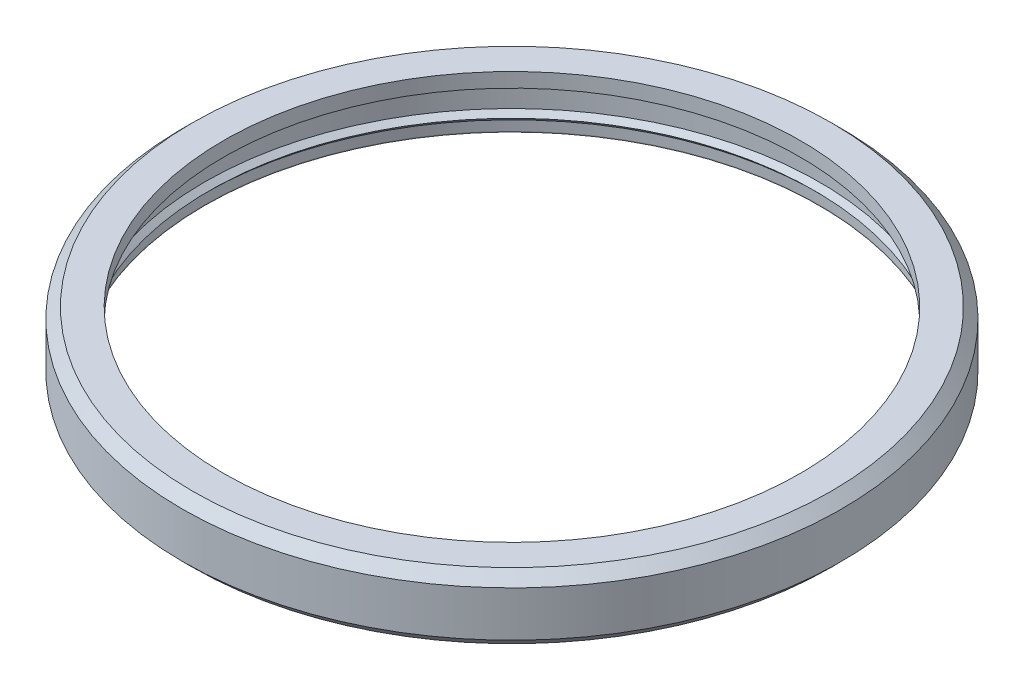
ISO-10303-21;
HEADER;
FILE_DESCRIPTION(('STEP AP214'),'2;1');
FILE_NAME('part.step','',(''),(''),'','','');
FILE_SCHEMA(('AUTOMOTIVE_DESIGN { 1 0 10303 214 1 1 1 1 }'));
ENDSEC;
DATA;
#1=APPLICATION_CONTEXT('core data for automotive mechanical design processes');
#2=APPLICATION_PROTOCOL_DEFINITION('international standard','automotive_design',2000,#1);
#3=PRODUCT_CONTEXT('',#1,'mechanical');
#4=PRODUCT('Part','Part','',(#3));
#5=PRODUCT_RELATED_PRODUCT_CATEGORY('part','',(#4));
#6=PRODUCT_DEFINITION_FORMATION('','',#4);
#7=PRODUCT_DEFINITION_CONTEXT('part definition',#1,'design');
#8=PRODUCT_DEFINITION('design','',#6,#7);
#9=PRODUCT_DEFINITION_SHAPE('','',#8);
#10=(LENGTH_UNIT() NAMED_UNIT(*) SI_UNIT(.MILLI.,.METRE.));
#11=(NAMED_UNIT(*) PLANE_ANGLE_UNIT() SI_UNIT($,.RADIAN.));
#12=(NAMED_UNIT(*) SI_UNIT($,.STERADIAN.) SOLID_ANGLE_UNIT());
#13=UNCERTAINTY_MEASURE_WITH_UNIT(LENGTH_MEASURE(1.E-05),#10,'distance_accuracy_value','');
#14=(GEOMETRIC_REPRESENTATION_CONTEXT(3) GLOBAL_UNCERTAINTY_ASSIGNED_CONTEXT((#13)) GLOBAL_UNIT_ASSIGNED_CONTEXT((#10,
#11,#12)) REPRESENTATION_CONTEXT('',''));
#15=CARTESIAN_POINT('',(0.,0.,0.));
#16=DIRECTION('',(0.,0.,1.));
#17=DIRECTION('',(1.,0.,0.));
#18=AXIS2_PLACEMENT_3D('',#15,#16,#17);
#19=CARTESIAN_POINT('',(0.,2.4,0.));
#20=DIRECTION('',(0.,-1.,0.));
#21=DIRECTION('',(0.,0.,-1.));
#22=AXIS2_PLACEMENT_3D('',#19,#20,#21);
#23=CYLINDRICAL_SURFACE('',#22,32.);
#24=CARTESIAN_POINT('',(0.,0.399999999999975,0.));
#25=DIRECTION('',(0.,1.,0.));
#26=DIRECTION('',(0.,0.,1.));
#27=AXIS2_PLACEMENT_3D('',#24,#25,#26);
#28=CIRCLE('',#27,32.);
#29=CARTESIAN_POINT('',(0.,0.399999999999975,32.));
#30=VERTEX_POINT('',#29);
#31=EDGE_CURVE('E10',#30,#30,#28,.F.);
#32=ORIENTED_EDGE('',*,*,#31,.T.);
#33=EDGE_LOOP('',(#32));
#34=FACE_BOUND('',#33,.T.);
#35=CARTESIAN_POINT('',(0.,-3.99999999999996,0.));
#36=DIRECTION('',(0.,1.,0.));
#37=DIRECTION('',(0.,0.,1.));
#38=AXIS2_PLACEMENT_3D('',#35,#36,#37);
#39=CIRCLE('',#38,32.);
#40=CARTESIAN_POINT('',(0.,-3.99999999999996,32.));
#41=VERTEX_POINT('',#40);
#42=EDGE_CURVE('E58',#41,#41,#39,.T.);
#43=ORIENTED_EDGE('',*,*,#42,.T.);
#44=EDGE_LOOP('',(#43));
#45=FACE_BOUND('',#44,.T.);
#46=ADVANCED_FACE('F43',(#34,#45),#23,.T.);
#47=CARTESIAN_POINT('',(0.,-7.6,0.));
#48=DIRECTION('',(0.,1.,0.));
#49=DIRECTION('',(0.,0.,1.));
#50=AXIS2_PLACEMENT_3D('',#47,#48,#49);
#51=CYLINDRICAL_SURFACE('',#50,28.);
#52=CARTESIAN_POINT('',(0.,0.,0.));
#53=DIRECTION('',(0.,1.,0.));
#54=DIRECTION('',(0.,0.,1.));
#55=AXIS2_PLACEMENT_3D('',#52,#53,#54);
#56=CIRCLE('',#55,28.);
#57=CARTESIAN_POINT('',(0.,0.,28.));
#58=VERTEX_POINT('',#57);
#59=EDGE_CURVE('E75',#58,#58,#56,.T.);
#60=ORIENTED_EDGE('',*,*,#59,.F.);
#61=EDGE_LOOP('',(#60));
#62=FACE_BOUND('',#61,.T.);
#63=CARTESIAN_POINT('',(0.,1.4,0.));
#64=DIRECTION('',(0.,1.,0.));
#65=DIRECTION('',(0.,0.,1.));
#66=AXIS2_PLACEMENT_3D('',#63,#64,#65);
#67=CIRCLE('',#66,28.);
#68=CARTESIAN_POINT('',(0.,1.4,28.));
#69=VERTEX_POINT('',#68);
#70=EDGE_CURVE('E71',#69,#69,#67,.F.);
#71=ORIENTED_EDGE('',*,*,#70,.F.);
#72=EDGE_LOOP('',(#71));
#73=FACE_BOUND('',#72,.T.);
#74=ADVANCED_FACE('F124',(#62,#73),#51,.F.);
#75=CARTESIAN_POINT('',(0.,-0.999999999999997,0.));
#76=DIRECTION('',(0.,-1.,0.));
#77=DIRECTION('',(1.,0.,0.));
#78=AXIS2_PLACEMENT_3D('',#75,#76,#77);
#79=TOROIDAL_SURFACE('',#78,28.8488095238095,1.00119047619048);
#80=CARTESIAN_POINT('',(0.,0.,0.));
#81=DIRECTION('',(0.,1.,0.));
#82=DIRECTION('',(0.,0.,1.));
#83=AXIS2_PLACEMENT_3D('',#80,#81,#82);
#84=CIRCLE('',#83,28.8976190476191);
#85=CARTESIAN_POINT('',(0.,0.,28.8976190476191));
#86=VERTEX_POINT('',#85);
#87=EDGE_CURVE('E70',#86,#86,#84,.T.);
#88=ORIENTED_EDGE('',*,*,#87,.T.);
#89=EDGE_LOOP('',(#88));
#90=FACE_BOUND('',#89,.T.);
#91=CARTESIAN_POINT('',(0.,-0.999999999999997,0.));
#92=DIRECTION('',(0.,-1.,0.));
#93=DIRECTION('',(1.,0.,0.));
#94=AXIS2_PLACEMENT_3D('',#91,#92,#93);
#95=CIRCLE('',#94,29.85);
#96=CARTESIAN_POINT('',(29.85,-1.,0.));
#97=VERTEX_POINT('',#96);
#98=EDGE_CURVE('E82',#97,#97,#95,.T.);
#99=ORIENTED_EDGE('',*,*,#98,.T.);
#100=EDGE_LOOP('',(#99));
#101=FACE_BOUND('',#100,.T.);
#102=ADVANCED_FACE('F129',(#90,#101),#79,.F.);
#103=CARTESIAN_POINT('',(0.,-25.,0.));
#104=DIRECTION('',(0.,-1.,0.));
#105=DIRECTION('',(1.,0.,0.));
#106=AXIS2_PLACEMENT_3D('',#103,#104,#105);
#107=CYLINDRICAL_SURFACE('',#106,29.85);
#108=ORIENTED_EDGE('',*,*,#98,.F.);
#109=EDGE_LOOP('',(#108));
#110=FACE_BOUND('',#109,.T.);
#111=CARTESIAN_POINT('',(0.,-3.02071067811865,0.));
#112=DIRECTION('',(0.,-1.,0.));
#113=DIRECTION('',(1.,0.,0.));
#114=AXIS2_PLACEMENT_3D('',#111,#112,#113);
#115=CIRCLE('',#114,29.85);
#116=CARTESIAN_POINT('',(29.85,-3.02071067811865,0.));
#117=VERTEX_POINT('',#116);
#118=EDGE_CURVE('E86',#117,#117,#115,.T.);
#119=ORIENTED_EDGE('',*,*,#118,.T.);
#120=EDGE_LOOP('',(#119));
#121=FACE_BOUND('',#120,.T.);
#122=ADVANCED_FACE('F191',(#110,#121),#107,.F.);
#123=CARTESIAN_POINT('',(0.,-3.5,0.));
#124=DIRECTION('',(0.,1.,0.));
#125=DIRECTION('',(-1.,0.,0.));
#126=AXIS2_PLACEMENT_3D('',#123,#124,#125);
#127=CONICAL_SURFACE('',#126,29.3707106781186,0.785398163397448);
#128=ORIENTED_EDGE('',*,*,#118,.F.);
#129=EDGE_LOOP('',(#128));
#130=FACE_BOUND('',#129,.T.);
#131=CARTESIAN_POINT('',(0.,-3.5,0.));
#132=DIRECTION('',(0.,-1.,0.));
#133=DIRECTION('',(1.,0.,0.));
#134=AXIS2_PLACEMENT_3D('',#131,#132,#133);
#135=CIRCLE('',#134,29.3707106781186);
#136=CARTESIAN_POINT('',(29.3707106781186,-3.50000000000001,0.));
#137=VERTEX_POINT('',#136);
#138=EDGE_CURVE('E89',#137,#137,#135,.T.);
#139=ORIENTED_EDGE('',*,*,#138,.T.);
#140=EDGE_LOOP('',(#139));
#141=FACE_BOUND('',#140,.T.);
#142=ADVANCED_FACE('F182',(#130,#141),#127,.F.);
#143=CARTESIAN_POINT('',(0.,-3.95750896858179,0.));
#144=DIRECTION('',(0.,-1.,0.));
#145=DIRECTION('',(1.,0.,0.));
#146=AXIS2_PLACEMENT_3D('',#143,#144,#145);
#147=CONICAL_SURFACE('',#146,29.8282196467004,0.78539816339746);
#148=ORIENTED_EDGE('',*,*,#138,.F.);
#149=EDGE_LOOP('',(#148));
#150=FACE_BOUND('',#149,.T.);
#151=CARTESIAN_POINT('',(0.,-3.95750896858179,0.));
#152=DIRECTION('',(0.,-1.,0.));
#153=DIRECTION('',(1.,0.,0.));
#154=AXIS2_PLACEMENT_3D('',#151,#152,#153);
#155=CIRCLE('',#154,29.8282196467004);
#156=CARTESIAN_POINT('',(29.8282196467004,-3.95750896858179,0.));
#157=VERTEX_POINT('',#156);
#158=EDGE_CURVE('E93',#157,#157,#155,.T.);
#159=ORIENTED_EDGE('',*,*,#158,.T.);
#160=EDGE_LOOP('',(#159));
#161=FACE_BOUND('',#160,.T.);
#162=ADVANCED_FACE('F173',(#150,#161),#147,.F.);
#163=CARTESIAN_POINT('',(0.,-4.95,0.));
#164=DIRECTION('',(0.,-1.,0.));
#165=DIRECTION('',(1.,0.,0.));
#166=AXIS2_PLACEMENT_3D('',#163,#164,#165);
#167=CONICAL_SURFACE('',#166,29.85,0.0219416168272341);
#168=ORIENTED_EDGE('',*,*,#158,.F.);
#169=EDGE_LOOP('',(#168));
#170=FACE_BOUND('',#169,.T.);
#171=CARTESIAN_POINT('',(0.,-4.95,0.));
#172=DIRECTION('',(0.,-1.,0.));
#173=DIRECTION('',(1.,0.,0.));
#174=AXIS2_PLACEMENT_3D('',#171,#172,#173);
#175=CIRCLE('',#174,29.85);
#176=CARTESIAN_POINT('',(29.85,-4.95,0.));
#177=VERTEX_POINT('',#176);
#178=EDGE_CURVE('E97',#177,#177,#175,.T.);
#179=ORIENTED_EDGE('',*,*,#178,.T.);
#180=EDGE_LOOP('',(#179));
#181=FACE_BOUND('',#180,.T.);
#182=ADVANCED_FACE('F120',(#170,#181),#167,.F.);
#183=CARTESIAN_POINT('',(0.,-25.,0.));
#184=DIRECTION('',(0.,-1.,0.));
#185=DIRECTION('',(1.,0.,0.));
#186=AXIS2_PLACEMENT_3D('',#183,#184,#185);
#187=CYLINDRICAL_SURFACE('',#186,29.85);
#188=CARTESIAN_POINT('',(0.,-5.,0.));
#189=DIRECTION('',(0.,-1.,0.));
#190=DIRECTION('',(1.,0.,0.));
#191=AXIS2_PLACEMENT_3D('',#188,#189,#190);
#192=CIRCLE('',#191,29.85);
#193=CARTESIAN_POINT('',(29.85,-5.,0.));
#194=VERTEX_POINT('',#193);
#195=EDGE_CURVE('E79',#194,#194,#192,.T.);
#196=ORIENTED_EDGE('',*,*,#195,.T.);
#197=EDGE_LOOP('',(#196));
#198=FACE_BOUND('',#197,.T.);
#199=ORIENTED_EDGE('',*,*,#178,.F.);
#200=EDGE_LOOP('',(#199));
#201=FACE_BOUND('',#200,.T.);
#202=ADVANCED_FACE('F105',(#198,#201),#187,.F.);
#203=CARTESIAN_POINT('',(0.,-5.,0.));
#204=DIRECTION('',(0.,1.,0.));
#205=DIRECTION('',(-1.,0.,0.));
#206=AXIS2_PLACEMENT_3D('',#203,#204,#205);
#207=PLANE('',#206);
#208=CARTESIAN_POINT('',(0.,-5.,0.));
#209=DIRECTION('',(0.,1.,0.));
#210=DIRECTION('',(-1.,0.,0.));
#211=AXIS2_PLACEMENT_3D('',#208,#209,#210);
#212=CIRCLE('',#211,31.);
#213=CARTESIAN_POINT('',(-31.,-5.,0.));
#214=VERTEX_POINT('',#213);
#215=EDGE_CURVE('E64',#214,#214,#212,.F.);
#216=ORIENTED_EDGE('',*,*,#215,.T.);
#217=EDGE_LOOP('',(#216));
#218=FACE_BOUND('',#217,.T.);
#219=ORIENTED_EDGE('',*,*,#195,.F.);
#220=EDGE_LOOP('',(#219));
#221=FACE_BOUND('',#220,.T.);
#222=ADVANCED_FACE('F108',(#218,#221),#207,.F.);
#223=CARTESIAN_POINT('',(0.,0.,0.));
#224=DIRECTION('',(0.,1.,0.));
#225=DIRECTION('',(0.,0.,1.));
#226=AXIS2_PLACEMENT_3D('',#223,#224,#225);
#227=PLANE('',#226);
#228=ORIENTED_EDGE('',*,*,#59,.T.);
#229=EDGE_LOOP('',(#228));
#230=FACE_BOUND('',#229,.T.);
#231=ORIENTED_EDGE('',*,*,#87,.F.);
#232=EDGE_LOOP('',(#231));
#233=FACE_BOUND('',#232,.T.);
#234=ADVANCED_FACE('F110',(#230,#233),#227,.F.);
#235=CARTESIAN_POINT('',(0.,1.4,0.));
#236=DIRECTION('',(0.,1.,0.));
#237=DIRECTION('',(0.,0.,1.));
#238=AXIS2_PLACEMENT_3D('',#235,#236,#237);
#239=PLANE('',#238);
#240=CARTESIAN_POINT('',(0.,1.4,0.));
#241=DIRECTION('',(0.,1.,0.));
#242=DIRECTION('',(0.,0.,1.));
#243=AXIS2_PLACEMENT_3D('',#240,#241,#242);
#244=CIRCLE('',#243,31.);
#245=CARTESIAN_POINT('',(0.,1.4,31.));
#246=VERTEX_POINT('',#245);
#247=EDGE_CURVE('E52',#246,#246,#244,.T.);
#248=ORIENTED_EDGE('',*,*,#247,.T.);
#249=EDGE_LOOP('',(#248));
#250=FACE_BOUND('',#249,.T.);
#251=ORIENTED_EDGE('',*,*,#70,.T.);
#252=EDGE_LOOP('',(#251));
#253=FACE_BOUND('',#252,.T.);
#254=ADVANCED_FACE('F117',(#250,#253),#239,.T.);
#255=CARTESIAN_POINT('',(0.,-5.,0.));
#256=DIRECTION('',(0.,1.,0.));
#257=DIRECTION('',(0.,0.,1.));
#258=AXIS2_PLACEMENT_3D('',#255,#256,#257);
#259=CONICAL_SURFACE('',#258,31.,0.785398163397434);
#260=ORIENTED_EDGE('',*,*,#42,.F.);
#261=EDGE_LOOP('',(#260));
#262=FACE_BOUND('',#261,.T.);
#263=ORIENTED_EDGE('',*,*,#215,.F.);
#264=EDGE_LOOP('',(#263));
#265=FACE_BOUND('',#264,.T.);
#266=ADVANCED_FACE('F134',(#262,#265),#259,.T.);
#267=CARTESIAN_POINT('',(0.,1.4,0.));
#268=DIRECTION('',(0.,-1.,0.));
#269=DIRECTION('',(0.,0.,-1.));
#270=AXIS2_PLACEMENT_3D('',#267,#268,#269);
#271=CONICAL_SURFACE('',#270,31.,0.785398163397441);
#272=ORIENTED_EDGE('',*,*,#31,.F.);
#273=EDGE_LOOP('',(#272));
#274=FACE_BOUND('',#273,.T.);
#275=ORIENTED_EDGE('',*,*,#247,.F.);
#276=EDGE_LOOP('',(#275));
#277=FACE_BOUND('',#276,.T.);
#278=ADVANCED_FACE('F46',(#274,#277),#271,.T.);
#279=CLOSED_SHELL('',(#46,#74,#102,#122,#142,#162,#182,#202,#222,#234,#254,#266,#278));
#280=MANIFOLD_SOLID_BREP('B2',#279);
#281=ADVANCED_BREP_SHAPE_REPRESENTATION('',(#18,#280),#14);
#282=SHAPE_DEFINITION_REPRESENTATION(#9,#281);
ENDSEC;
END-ISO-10303-21;
